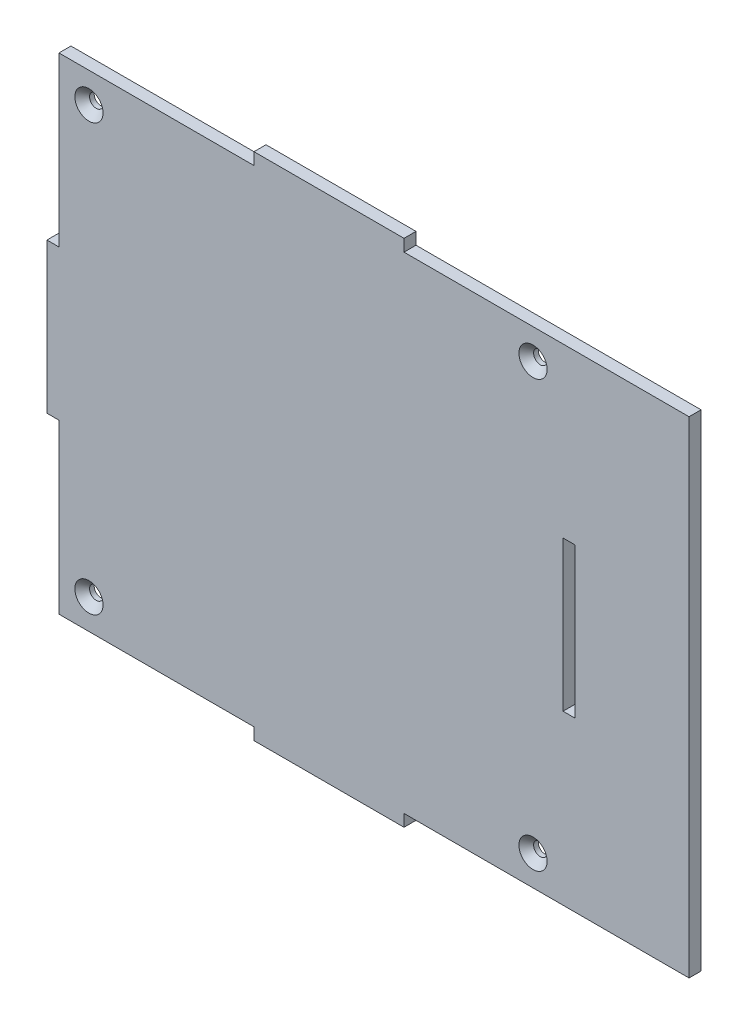
ISO-10303-21;
HEADER;
FILE_DESCRIPTION(('STEP AP214'),'2;1');
FILE_NAME('part.step','',(''),(''),'','','');
FILE_SCHEMA(('AUTOMOTIVE_DESIGN { 1 0 10303 214 1 1 1 1 }'));
ENDSEC;
DATA;
#1=APPLICATION_CONTEXT('core data for automotive mechanical design processes');
#2=APPLICATION_PROTOCOL_DEFINITION('international standard','automotive_design',2000,#1);
#3=PRODUCT_CONTEXT('',#1,'mechanical');
#4=PRODUCT('Part','Part','',(#3));
#5=PRODUCT_RELATED_PRODUCT_CATEGORY('part','',(#4));
#6=PRODUCT_DEFINITION_FORMATION('','',#4);
#7=PRODUCT_DEFINITION_CONTEXT('part definition',#1,'design');
#8=PRODUCT_DEFINITION('design','',#6,#7);
#9=PRODUCT_DEFINITION_SHAPE('','',#8);
#10=(LENGTH_UNIT() NAMED_UNIT(*) SI_UNIT(.MILLI.,.METRE.));
#11=(NAMED_UNIT(*) PLANE_ANGLE_UNIT() SI_UNIT($,.RADIAN.));
#12=(NAMED_UNIT(*) SI_UNIT($,.STERADIAN.) SOLID_ANGLE_UNIT());
#13=UNCERTAINTY_MEASURE_WITH_UNIT(LENGTH_MEASURE(1.E-05),#10,'distance_accuracy_value','');
#14=(GEOMETRIC_REPRESENTATION_CONTEXT(3) GLOBAL_UNCERTAINTY_ASSIGNED_CONTEXT((#13)) GLOBAL_UNIT_ASSIGNED_CONTEXT((#10,
#11,#12)) REPRESENTATION_CONTEXT('',''));
#15=CARTESIAN_POINT('',(0.,0.,0.));
#16=DIRECTION('',(0.,0.,1.));
#17=DIRECTION('',(1.,0.,0.));
#18=AXIS2_PLACEMENT_3D('',#15,#16,#17);
#19=CARTESIAN_POINT('',(0.,0.,4.));
#20=DIRECTION('',(0.,0.,1.));
#21=DIRECTION('',(1.,0.,0.));
#22=AXIS2_PLACEMENT_3D('',#19,#20,#21);
#23=PLANE('',#22);
#24=CARTESIAN_POINT('',(14.,71.,4.));
#25=DIRECTION('',(0.,0.,1.));
#26=DIRECTION('',(1.,0.,0.));
#27=AXIS2_PLACEMENT_3D('',#24,#25,#26);
#28=CIRCLE('',#27,4.7);
#29=CARTESIAN_POINT('',(18.7,71.,4.));
#30=VERTEX_POINT('',#29);
#31=EDGE_CURVE('E669',#30,#30,#28,.T.);
#32=ORIENTED_EDGE('',*,*,#31,.F.);
#33=EDGE_LOOP('',(#32));
#34=FACE_BOUND('',#33,.T.);
#35=CARTESIAN_POINT('',(162.,71.,4.));
#36=DIRECTION('',(0.,0.,1.));
#37=DIRECTION('',(1.,0.,0.));
#38=AXIS2_PLACEMENT_3D('',#35,#36,#37);
#39=CIRCLE('',#38,4.70000000000001);
#40=CARTESIAN_POINT('',(166.7,71.,4.));
#41=VERTEX_POINT('',#40);
#42=EDGE_CURVE('E676',#41,#41,#39,.T.);
#43=ORIENTED_EDGE('',*,*,#42,.F.);
#44=EDGE_LOOP('',(#43));
#45=FACE_BOUND('',#44,.T.);
#46=CARTESIAN_POINT('',(162.,-71.,4.));
#47=DIRECTION('',(0.,0.,1.));
#48=DIRECTION('',(1.,0.,0.));
#49=AXIS2_PLACEMENT_3D('',#46,#47,#48);
#50=CIRCLE('',#49,4.70000000000001);
#51=CARTESIAN_POINT('',(166.7,-71.,4.));
#52=VERTEX_POINT('',#51);
#53=EDGE_CURVE('E685',#52,#52,#50,.T.);
#54=ORIENTED_EDGE('',*,*,#53,.F.);
#55=EDGE_LOOP('',(#54));
#56=FACE_BOUND('',#55,.T.);
#57=CARTESIAN_POINT('',(14.,-71.,4.));
#58=DIRECTION('',(0.,0.,1.));
#59=DIRECTION('',(1.,0.,0.));
#60=AXIS2_PLACEMENT_3D('',#57,#58,#59);
#61=CIRCLE('',#60,4.7);
#62=CARTESIAN_POINT('',(18.7,-71.,4.));
#63=VERTEX_POINT('',#62);
#64=EDGE_CURVE('E694',#63,#63,#61,.T.);
#65=ORIENTED_EDGE('',*,*,#64,.F.);
#66=EDGE_LOOP('',(#65));
#67=FACE_BOUND('',#66,.T.);
#68=DIRECTION('',(0.,1.,0.));
#69=VECTOR('',#68,1.);
#70=CARTESIAN_POINT('',(0.,0.,4.));
#71=LINE('',#70,#69);
#72=CARTESIAN_POINT('',(0.,-25.,4.));
#73=VERTEX_POINT('',#72);
#74=CARTESIAN_POINT('',(0.,25.,4.));
#75=VERTEX_POINT('',#74);
#76=EDGE_CURVE('E209',#73,#75,#71,.T.);
#77=ORIENTED_EDGE('',*,*,#76,.F.);
#78=DIRECTION('',(1.,0.,0.));
#79=VECTOR('',#78,1.);
#80=CARTESIAN_POINT('',(0.,-25.,4.));
#81=LINE('',#80,#79);
#82=CARTESIAN_POINT('',(4.,-25.,4.));
#83=VERTEX_POINT('',#82);
#84=EDGE_CURVE('E212',#73,#83,#81,.T.);
#85=ORIENTED_EDGE('',*,*,#84,.T.);
#86=DIRECTION('',(0.,-1.,0.));
#87=VECTOR('',#86,1.);
#88=CARTESIAN_POINT('',(3.99999999999999,0.,4.));
#89=LINE('',#88,#87);
#90=CARTESIAN_POINT('',(4.,-81.,4.));
#91=VERTEX_POINT('',#90);
#92=EDGE_CURVE('E215',#83,#91,#89,.T.);
#93=ORIENTED_EDGE('',*,*,#92,.T.);
#94=DIRECTION('',(1.,0.,0.));
#95=VECTOR('',#94,1.);
#96=CARTESIAN_POINT('',(0.,-81.,4.));
#97=LINE('',#96,#95);
#98=CARTESIAN_POINT('',(69.,-81.,4.));
#99=VERTEX_POINT('',#98);
#100=EDGE_CURVE('E217',#91,#99,#97,.T.);
#101=ORIENTED_EDGE('',*,*,#100,.T.);
#102=DIRECTION('',(0.,-1.,0.));
#103=VECTOR('',#102,1.);
#104=CARTESIAN_POINT('',(69.,0.,4.));
#105=LINE('',#104,#103);
#106=CARTESIAN_POINT('',(69.,-85.,4.));
#107=VERTEX_POINT('',#106);
#108=EDGE_CURVE('E219',#99,#107,#105,.T.);
#109=ORIENTED_EDGE('',*,*,#108,.T.);
#110=DIRECTION('',(1.,0.,0.));
#111=VECTOR('',#110,1.);
#112=CARTESIAN_POINT('',(0.,-85.,4.));
#113=LINE('',#112,#111);
#114=CARTESIAN_POINT('',(119.,-85.,4.));
#115=VERTEX_POINT('',#114);
#116=EDGE_CURVE('E221',#107,#115,#113,.T.);
#117=ORIENTED_EDGE('',*,*,#116,.T.);
#118=DIRECTION('',(0.,1.,0.));
#119=VECTOR('',#118,1.);
#120=CARTESIAN_POINT('',(119.,0.,4.));
#121=LINE('',#120,#119);
#122=CARTESIAN_POINT('',(119.,-81.,4.));
#123=VERTEX_POINT('',#122);
#124=EDGE_CURVE('E223',#115,#123,#121,.T.);
#125=ORIENTED_EDGE('',*,*,#124,.T.);
#126=DIRECTION('',(1.,0.,0.));
#127=VECTOR('',#126,1.);
#128=CARTESIAN_POINT('',(0.,-81.,4.));
#129=LINE('',#128,#127);
#130=CARTESIAN_POINT('',(214.,-81.,4.));
#131=VERTEX_POINT('',#130);
#132=EDGE_CURVE('E225',#123,#131,#129,.T.);
#133=ORIENTED_EDGE('',*,*,#132,.T.);
#134=DIRECTION('',(0.,-1.,0.));
#135=VECTOR('',#134,1.);
#136=CARTESIAN_POINT('',(214.,0.,4.));
#137=LINE('',#136,#135);
#138=CARTESIAN_POINT('',(214.,81.,4.));
#139=VERTEX_POINT('',#138);
#140=EDGE_CURVE('E227',#139,#131,#137,.T.);
#141=ORIENTED_EDGE('',*,*,#140,.F.);
#142=DIRECTION('',(1.,0.,0.));
#143=VECTOR('',#142,1.);
#144=CARTESIAN_POINT('',(0.,81.,4.));
#145=LINE('',#144,#143);
#146=CARTESIAN_POINT('',(119.,81.,4.));
#147=VERTEX_POINT('',#146);
#148=EDGE_CURVE('E230',#147,#139,#145,.T.);
#149=ORIENTED_EDGE('',*,*,#148,.F.);
#150=DIRECTION('',(0.,-1.,0.));
#151=VECTOR('',#150,1.);
#152=CARTESIAN_POINT('',(119.,0.,4.));
#153=LINE('',#152,#151);
#154=CARTESIAN_POINT('',(119.,85.,4.));
#155=VERTEX_POINT('',#154);
#156=EDGE_CURVE('E233',#155,#147,#153,.T.);
#157=ORIENTED_EDGE('',*,*,#156,.F.);
#158=DIRECTION('',(1.,0.,0.));
#159=VECTOR('',#158,1.);
#160=CARTESIAN_POINT('',(0.,85.,4.));
#161=LINE('',#160,#159);
#162=CARTESIAN_POINT('',(69.,85.,4.));
#163=VERTEX_POINT('',#162);
#164=EDGE_CURVE('E236',#163,#155,#161,.T.);
#165=ORIENTED_EDGE('',*,*,#164,.F.);
#166=DIRECTION('',(0.,1.,0.));
#167=VECTOR('',#166,1.);
#168=CARTESIAN_POINT('',(69.,0.,4.));
#169=LINE('',#168,#167);
#170=CARTESIAN_POINT('',(69.,81.,4.));
#171=VERTEX_POINT('',#170);
#172=EDGE_CURVE('E239',#171,#163,#169,.T.);
#173=ORIENTED_EDGE('',*,*,#172,.F.);
#174=DIRECTION('',(1.,0.,0.));
#175=VECTOR('',#174,1.);
#176=CARTESIAN_POINT('',(0.,81.,4.));
#177=LINE('',#176,#175);
#178=CARTESIAN_POINT('',(4.,81.,4.));
#179=VERTEX_POINT('',#178);
#180=EDGE_CURVE('E242',#179,#171,#177,.T.);
#181=ORIENTED_EDGE('',*,*,#180,.F.);
#182=DIRECTION('',(0.,1.,0.));
#183=VECTOR('',#182,1.);
#184=CARTESIAN_POINT('',(4.,0.,4.));
#185=LINE('',#184,#183);
#186=CARTESIAN_POINT('',(4.,25.,4.));
#187=VERTEX_POINT('',#186);
#188=EDGE_CURVE('E245',#187,#179,#185,.T.);
#189=ORIENTED_EDGE('',*,*,#188,.F.);
#190=DIRECTION('',(1.,0.,0.));
#191=VECTOR('',#190,1.);
#192=CARTESIAN_POINT('',(0.,25.,4.));
#193=LINE('',#192,#191);
#194=EDGE_CURVE('E248',#75,#187,#193,.T.);
#195=ORIENTED_EDGE('',*,*,#194,.F.);
#196=EDGE_LOOP('',(#77,#85,#93,#101,#109,#117,#125,#133,#141,#149,#157,#165,#173,#181,#189,#195));
#197=FACE_BOUND('',#196,.T.);
#198=DIRECTION('',(1.,0.,0.));
#199=VECTOR('',#198,1.);
#200=CARTESIAN_POINT('',(0.,-25.,4.));
#201=LINE('',#200,#199);
#202=CARTESIAN_POINT('',(172.,-25.,4.));
#203=VERTEX_POINT('',#202);
#204=CARTESIAN_POINT('',(176.,-25.,4.));
#205=VERTEX_POINT('',#204);
#206=EDGE_CURVE('E194',#203,#205,#201,.T.);
#207=ORIENTED_EDGE('',*,*,#206,.F.);
#208=DIRECTION('',(0.,1.,0.));
#209=VECTOR('',#208,1.);
#210=CARTESIAN_POINT('',(172.,0.,4.));
#211=LINE('',#210,#209);
#212=CARTESIAN_POINT('',(172.,25.,4.));
#213=VERTEX_POINT('',#212);
#214=EDGE_CURVE('E52',#203,#213,#211,.T.);
#215=ORIENTED_EDGE('',*,*,#214,.T.);
#216=DIRECTION('',(1.,0.,0.));
#217=VECTOR('',#216,1.);
#218=CARTESIAN_POINT('',(0.,25.,4.));
#219=LINE('',#218,#217);
#220=CARTESIAN_POINT('',(176.,25.,4.));
#221=VERTEX_POINT('',#220);
#222=EDGE_CURVE('E181',#213,#221,#219,.T.);
#223=ORIENTED_EDGE('',*,*,#222,.T.);
#224=DIRECTION('',(0.,1.,0.));
#225=VECTOR('',#224,1.);
#226=CARTESIAN_POINT('',(176.,0.,4.));
#227=LINE('',#226,#225);
#228=EDGE_CURVE('E200',#205,#221,#227,.T.);
#229=ORIENTED_EDGE('',*,*,#228,.F.);
#230=EDGE_LOOP('',(#207,#215,#223,#229));
#231=FACE_BOUND('',#230,.T.);
#232=ADVANCED_FACE('F37',(#34,#45,#56,#67,#197,#231),#23,.T.);
#233=CARTESIAN_POINT('',(0.,0.,0.));
#234=DIRECTION('',(0.,0.,1.));
#235=DIRECTION('',(1.,0.,0.));
#236=AXIS2_PLACEMENT_3D('',#233,#234,#235);
#237=PLANE('',#236);
#238=CARTESIAN_POINT('',(14.,71.,0.));
#239=DIRECTION('',(0.,0.,1.));
#240=DIRECTION('',(1.,0.,0.));
#241=AXIS2_PLACEMENT_3D('',#238,#239,#240);
#242=CIRCLE('',#241,2.25);
#243=CARTESIAN_POINT('',(16.25,71.,0.));
#244=VERTEX_POINT('',#243);
#245=EDGE_CURVE('E671',#244,#244,#242,.T.);
#246=ORIENTED_EDGE('',*,*,#245,.T.);
#247=EDGE_LOOP('',(#246));
#248=FACE_BOUND('',#247,.T.);
#249=CARTESIAN_POINT('',(162.,71.,0.));
#250=DIRECTION('',(0.,0.,1.));
#251=DIRECTION('',(1.,0.,0.));
#252=AXIS2_PLACEMENT_3D('',#249,#250,#251);
#253=CIRCLE('',#252,2.25);
#254=CARTESIAN_POINT('',(164.25,71.,0.));
#255=VERTEX_POINT('',#254);
#256=EDGE_CURVE('E682',#255,#255,#253,.T.);
#257=ORIENTED_EDGE('',*,*,#256,.T.);
#258=EDGE_LOOP('',(#257));
#259=FACE_BOUND('',#258,.T.);
#260=CARTESIAN_POINT('',(162.,-71.,0.));
#261=DIRECTION('',(0.,0.,1.));
#262=DIRECTION('',(1.,0.,0.));
#263=AXIS2_PLACEMENT_3D('',#260,#261,#262);
#264=CIRCLE('',#263,2.25);
#265=CARTESIAN_POINT('',(164.25,-71.,0.));
#266=VERTEX_POINT('',#265);
#267=EDGE_CURVE('E691',#266,#266,#264,.T.);
#268=ORIENTED_EDGE('',*,*,#267,.T.);
#269=EDGE_LOOP('',(#268));
#270=FACE_BOUND('',#269,.T.);
#271=CARTESIAN_POINT('',(14.,-71.,0.));
#272=DIRECTION('',(0.,0.,1.));
#273=DIRECTION('',(1.,0.,0.));
#274=AXIS2_PLACEMENT_3D('',#271,#272,#273);
#275=CIRCLE('',#274,2.25);
#276=CARTESIAN_POINT('',(16.25,-71.,0.));
#277=VERTEX_POINT('',#276);
#278=EDGE_CURVE('E700',#277,#277,#275,.T.);
#279=ORIENTED_EDGE('',*,*,#278,.T.);
#280=EDGE_LOOP('',(#279));
#281=FACE_BOUND('',#280,.T.);
#282=DIRECTION('',(0.,1.,0.));
#283=VECTOR('',#282,1.);
#284=CARTESIAN_POINT('',(0.,0.,0.));
#285=LINE('',#284,#283);
#286=CARTESIAN_POINT('',(0.,-25.,0.));
#287=VERTEX_POINT('',#286);
#288=CARTESIAN_POINT('',(0.,25.,0.));
#289=VERTEX_POINT('',#288);
#290=EDGE_CURVE('E187',#287,#289,#285,.T.);
#291=ORIENTED_EDGE('',*,*,#290,.T.);
#292=DIRECTION('',(1.,0.,0.));
#293=VECTOR('',#292,1.);
#294=CARTESIAN_POINT('',(0.,25.,0.));
#295=LINE('',#294,#293);
#296=CARTESIAN_POINT('',(4.,25.,0.));
#297=VERTEX_POINT('',#296);
#298=EDGE_CURVE('E213',#289,#297,#295,.T.);
#299=ORIENTED_EDGE('',*,*,#298,.T.);
#300=DIRECTION('',(0.,1.,0.));
#301=VECTOR('',#300,1.);
#302=CARTESIAN_POINT('',(4.,0.,0.));
#303=LINE('',#302,#301);
#304=CARTESIAN_POINT('',(4.,81.,0.));
#305=VERTEX_POINT('',#304);
#306=EDGE_CURVE('E287',#297,#305,#303,.T.);
#307=ORIENTED_EDGE('',*,*,#306,.T.);
#308=DIRECTION('',(1.,0.,0.));
#309=VECTOR('',#308,1.);
#310=CARTESIAN_POINT('',(0.,81.,0.));
#311=LINE('',#310,#309);
#312=CARTESIAN_POINT('',(69.,81.,0.));
#313=VERTEX_POINT('',#312);
#314=EDGE_CURVE('E284',#305,#313,#311,.T.);
#315=ORIENTED_EDGE('',*,*,#314,.T.);
#316=DIRECTION('',(0.,1.,0.));
#317=VECTOR('',#316,1.);
#318=CARTESIAN_POINT('',(69.,0.,0.));
#319=LINE('',#318,#317);
#320=CARTESIAN_POINT('',(69.,85.,0.));
#321=VERTEX_POINT('',#320);
#322=EDGE_CURVE('E281',#313,#321,#319,.T.);
#323=ORIENTED_EDGE('',*,*,#322,.T.);
#324=DIRECTION('',(1.,0.,0.));
#325=VECTOR('',#324,1.);
#326=CARTESIAN_POINT('',(0.,85.,0.));
#327=LINE('',#326,#325);
#328=CARTESIAN_POINT('',(119.,85.,0.));
#329=VERTEX_POINT('',#328);
#330=EDGE_CURVE('E278',#321,#329,#327,.T.);
#331=ORIENTED_EDGE('',*,*,#330,.T.);
#332=DIRECTION('',(0.,-1.,0.));
#333=VECTOR('',#332,1.);
#334=CARTESIAN_POINT('',(119.,0.,0.));
#335=LINE('',#334,#333);
#336=CARTESIAN_POINT('',(119.,81.,0.));
#337=VERTEX_POINT('',#336);
#338=EDGE_CURVE('E275',#329,#337,#335,.T.);
#339=ORIENTED_EDGE('',*,*,#338,.T.);
#340=DIRECTION('',(1.,0.,0.));
#341=VECTOR('',#340,1.);
#342=CARTESIAN_POINT('',(0.,81.,0.));
#343=LINE('',#342,#341);
#344=CARTESIAN_POINT('',(214.,81.,0.));
#345=VERTEX_POINT('',#344);
#346=EDGE_CURVE('E272',#337,#345,#343,.T.);
#347=ORIENTED_EDGE('',*,*,#346,.T.);
#348=DIRECTION('',(0.,-1.,0.));
#349=VECTOR('',#348,1.);
#350=CARTESIAN_POINT('',(214.,0.,0.));
#351=LINE('',#350,#349);
#352=CARTESIAN_POINT('',(214.,-81.,0.));
#353=VERTEX_POINT('',#352);
#354=EDGE_CURVE('E269',#345,#353,#351,.T.);
#355=ORIENTED_EDGE('',*,*,#354,.T.);
#356=DIRECTION('',(1.,0.,0.));
#357=VECTOR('',#356,1.);
#358=CARTESIAN_POINT('',(0.,-81.,0.));
#359=LINE('',#358,#357);
#360=CARTESIAN_POINT('',(119.,-81.,0.));
#361=VERTEX_POINT('',#360);
#362=EDGE_CURVE('E266',#361,#353,#359,.T.);
#363=ORIENTED_EDGE('',*,*,#362,.F.);
#364=DIRECTION('',(0.,1.,0.));
#365=VECTOR('',#364,1.);
#366=CARTESIAN_POINT('',(119.,0.,0.));
#367=LINE('',#366,#365);
#368=CARTESIAN_POINT('',(119.,-85.,0.));
#369=VERTEX_POINT('',#368);
#370=EDGE_CURVE('E264',#369,#361,#367,.T.);
#371=ORIENTED_EDGE('',*,*,#370,.F.);
#372=DIRECTION('',(1.,0.,0.));
#373=VECTOR('',#372,1.);
#374=CARTESIAN_POINT('',(0.,-85.,0.));
#375=LINE('',#374,#373);
#376=CARTESIAN_POINT('',(69.,-85.,0.));
#377=VERTEX_POINT('',#376);
#378=EDGE_CURVE('E262',#377,#369,#375,.T.);
#379=ORIENTED_EDGE('',*,*,#378,.F.);
#380=DIRECTION('',(0.,-1.,0.));
#381=VECTOR('',#380,1.);
#382=CARTESIAN_POINT('',(69.,0.,0.));
#383=LINE('',#382,#381);
#384=CARTESIAN_POINT('',(69.,-81.,0.));
#385=VERTEX_POINT('',#384);
#386=EDGE_CURVE('E260',#385,#377,#383,.T.);
#387=ORIENTED_EDGE('',*,*,#386,.F.);
#388=DIRECTION('',(1.,0.,0.));
#389=VECTOR('',#388,1.);
#390=CARTESIAN_POINT('',(0.,-81.,0.));
#391=LINE('',#390,#389);
#392=CARTESIAN_POINT('',(4.,-81.,0.));
#393=VERTEX_POINT('',#392);
#394=EDGE_CURVE('E258',#393,#385,#391,.T.);
#395=ORIENTED_EDGE('',*,*,#394,.F.);
#396=DIRECTION('',(0.,-1.,0.));
#397=VECTOR('',#396,1.);
#398=CARTESIAN_POINT('',(3.99999999999999,0.,0.));
#399=LINE('',#398,#397);
#400=CARTESIAN_POINT('',(4.,-25.,0.));
#401=VERTEX_POINT('',#400);
#402=EDGE_CURVE('E256',#401,#393,#399,.T.);
#403=ORIENTED_EDGE('',*,*,#402,.F.);
#404=DIRECTION('',(1.,0.,0.));
#405=VECTOR('',#404,1.);
#406=CARTESIAN_POINT('',(0.,-25.,0.));
#407=LINE('',#406,#405);
#408=EDGE_CURVE('E254',#287,#401,#407,.T.);
#409=ORIENTED_EDGE('',*,*,#408,.F.);
#410=EDGE_LOOP('',(#291,#299,#307,#315,#323,#331,#339,#347,#355,#363,#371,#379,#387,#395,#403,#409));
#411=FACE_BOUND('',#410,.T.);
#412=DIRECTION('',(0.,-1.,0.));
#413=VECTOR('',#412,1.);
#414=CARTESIAN_POINT('',(172.,0.,0.));
#415=LINE('',#414,#413);
#416=CARTESIAN_POINT('',(172.,25.,0.));
#417=VERTEX_POINT('',#416);
#418=CARTESIAN_POINT('',(172.,-25.,0.));
#419=VERTEX_POINT('',#418);
#420=EDGE_CURVE('E175',#417,#419,#415,.T.);
#421=ORIENTED_EDGE('',*,*,#420,.T.);
#422=DIRECTION('',(-1.,0.,0.));
#423=VECTOR('',#422,1.);
#424=CARTESIAN_POINT('',(0.,-25.,0.));
#425=LINE('',#424,#423);
#426=CARTESIAN_POINT('',(176.,-25.,0.));
#427=VERTEX_POINT('',#426);
#428=EDGE_CURVE('E184',#427,#419,#425,.T.);
#429=ORIENTED_EDGE('',*,*,#428,.F.);
#430=DIRECTION('',(0.,-1.,0.));
#431=VECTOR('',#430,1.);
#432=CARTESIAN_POINT('',(176.,0.,0.));
#433=LINE('',#432,#431);
#434=CARTESIAN_POINT('',(176.,25.,0.));
#435=VERTEX_POINT('',#434);
#436=EDGE_CURVE('E60',#435,#427,#433,.T.);
#437=ORIENTED_EDGE('',*,*,#436,.F.);
#438=DIRECTION('',(-1.,0.,0.));
#439=VECTOR('',#438,1.);
#440=CARTESIAN_POINT('',(0.,25.,0.));
#441=LINE('',#440,#439);
#442=EDGE_CURVE('E192',#435,#417,#441,.T.);
#443=ORIENTED_EDGE('',*,*,#442,.T.);
#444=EDGE_LOOP('',(#421,#429,#437,#443));
#445=FACE_BOUND('',#444,.T.);
#446=ADVANCED_FACE('F190',(#248,#259,#270,#281,#411,#445),#237,.F.);
#447=CARTESIAN_POINT('',(0.,0.,4.));
#448=DIRECTION('',(-1.,0.,0.));
#449=DIRECTION('',(0.,0.,1.));
#450=AXIS2_PLACEMENT_3D('',#447,#448,#449);
#451=PLANE('',#450);
#452=ORIENTED_EDGE('',*,*,#290,.F.);
#453=DIRECTION('',(0.,0.,-1.));
#454=VECTOR('',#453,1.);
#455=CARTESIAN_POINT('',(0.,-25.,4.));
#456=LINE('',#455,#454);
#457=EDGE_CURVE('E11',#73,#287,#456,.T.);
#458=ORIENTED_EDGE('',*,*,#457,.F.);
#459=ORIENTED_EDGE('',*,*,#76,.T.);
#460=DIRECTION('',(0.,0.,-1.));
#461=VECTOR('',#460,1.);
#462=CARTESIAN_POINT('',(0.,25.,4.));
#463=LINE('',#462,#461);
#464=EDGE_CURVE('E251',#75,#289,#463,.T.);
#465=ORIENTED_EDGE('',*,*,#464,.T.);
#466=EDGE_LOOP('',(#452,#458,#459,#465));
#467=FACE_BOUND('',#466,.T.);
#468=ADVANCED_FACE('F39',(#467),#451,.T.);
#469=CARTESIAN_POINT('',(0.,-25.,4.));
#470=DIRECTION('',(0.,1.,0.));
#471=DIRECTION('',(0.,0.,1.));
#472=AXIS2_PLACEMENT_3D('',#469,#470,#471);
#473=PLANE('',#472);
#474=ORIENTED_EDGE('',*,*,#408,.T.);
#475=DIRECTION('',(0.,0.,-1.));
#476=VECTOR('',#475,1.);
#477=CARTESIAN_POINT('',(4.,-25.,4.));
#478=LINE('',#477,#476);
#479=EDGE_CURVE('E45',#83,#401,#478,.T.);
#480=ORIENTED_EDGE('',*,*,#479,.F.);
#481=ORIENTED_EDGE('',*,*,#84,.F.);
#482=ORIENTED_EDGE('',*,*,#457,.T.);
#483=EDGE_LOOP('',(#474,#480,#481,#482));
#484=FACE_BOUND('',#483,.T.);
#485=ADVANCED_FACE('F352',(#484),#473,.F.);
#486=CARTESIAN_POINT('',(3.99999999999999,0.,4.));
#487=DIRECTION('',(1.,0.,0.));
#488=DIRECTION('',(0.,1.,0.));
#489=AXIS2_PLACEMENT_3D('',#486,#487,#488);
#490=PLANE('',#489);
#491=ORIENTED_EDGE('',*,*,#402,.T.);
#492=DIRECTION('',(0.,0.,-1.));
#493=VECTOR('',#492,1.);
#494=CARTESIAN_POINT('',(4.,-81.,4.));
#495=LINE('',#494,#493);
#496=EDGE_CURVE('E321',#91,#393,#495,.T.);
#497=ORIENTED_EDGE('',*,*,#496,.F.);
#498=ORIENTED_EDGE('',*,*,#92,.F.);
#499=ORIENTED_EDGE('',*,*,#479,.T.);
#500=EDGE_LOOP('',(#491,#497,#498,#499));
#501=FACE_BOUND('',#500,.T.);
#502=ADVANCED_FACE('F328',(#501),#490,.F.);
#503=CARTESIAN_POINT('',(0.,-81.,4.));
#504=DIRECTION('',(0.,1.,0.));
#505=DIRECTION('',(0.,0.,1.));
#506=AXIS2_PLACEMENT_3D('',#503,#504,#505);
#507=PLANE('',#506);
#508=ORIENTED_EDGE('',*,*,#394,.T.);
#509=DIRECTION('',(0.,0.,-1.));
#510=VECTOR('',#509,1.);
#511=CARTESIAN_POINT('',(69.,-81.,4.));
#512=LINE('',#511,#510);
#513=EDGE_CURVE('E318',#99,#385,#512,.T.);
#514=ORIENTED_EDGE('',*,*,#513,.F.);
#515=ORIENTED_EDGE('',*,*,#100,.F.);
#516=ORIENTED_EDGE('',*,*,#496,.T.);
#517=EDGE_LOOP('',(#508,#514,#515,#516));
#518=FACE_BOUND('',#517,.T.);
#519=ADVANCED_FACE('F340',(#518),#507,.F.);
#520=CARTESIAN_POINT('',(69.,0.,4.));
#521=DIRECTION('',(1.,0.,0.));
#522=DIRECTION('',(0.,0.,-1.));
#523=AXIS2_PLACEMENT_3D('',#520,#521,#522);
#524=PLANE('',#523);
#525=ORIENTED_EDGE('',*,*,#386,.T.);
#526=DIRECTION('',(0.,0.,-1.));
#527=VECTOR('',#526,1.);
#528=CARTESIAN_POINT('',(69.,-85.,4.));
#529=LINE('',#528,#527);
#530=EDGE_CURVE('E315',#107,#377,#529,.T.);
#531=ORIENTED_EDGE('',*,*,#530,.F.);
#532=ORIENTED_EDGE('',*,*,#108,.F.);
#533=ORIENTED_EDGE('',*,*,#513,.T.);
#534=EDGE_LOOP('',(#525,#531,#532,#533));
#535=FACE_BOUND('',#534,.T.);
#536=ADVANCED_FACE('F344',(#535),#524,.F.);
#537=CARTESIAN_POINT('',(0.,-85.,4.));
#538=DIRECTION('',(0.,1.,0.));
#539=DIRECTION('',(-1.,0.,0.));
#540=AXIS2_PLACEMENT_3D('',#537,#538,#539);
#541=PLANE('',#540);
#542=ORIENTED_EDGE('',*,*,#378,.T.);
#543=DIRECTION('',(0.,0.,-1.));
#544=VECTOR('',#543,1.);
#545=CARTESIAN_POINT('',(119.,-85.,4.));
#546=LINE('',#545,#544);
#547=EDGE_CURVE('E312',#115,#369,#546,.T.);
#548=ORIENTED_EDGE('',*,*,#547,.F.);
#549=ORIENTED_EDGE('',*,*,#116,.F.);
#550=ORIENTED_EDGE('',*,*,#530,.T.);
#551=EDGE_LOOP('',(#542,#548,#549,#550));
#552=FACE_BOUND('',#551,.T.);
#553=ADVANCED_FACE('F396',(#552),#541,.F.);
#554=CARTESIAN_POINT('',(119.,0.,4.));
#555=DIRECTION('',(-1.,0.,0.));
#556=DIRECTION('',(0.,0.,1.));
#557=AXIS2_PLACEMENT_3D('',#554,#555,#556);
#558=PLANE('',#557);
#559=ORIENTED_EDGE('',*,*,#370,.T.);
#560=DIRECTION('',(0.,0.,-1.));
#561=VECTOR('',#560,1.);
#562=CARTESIAN_POINT('',(119.,-81.,4.));
#563=LINE('',#562,#561);
#564=EDGE_CURVE('E309',#123,#361,#563,.T.);
#565=ORIENTED_EDGE('',*,*,#564,.F.);
#566=ORIENTED_EDGE('',*,*,#124,.F.);
#567=ORIENTED_EDGE('',*,*,#547,.T.);
#568=EDGE_LOOP('',(#559,#565,#566,#567));
#569=FACE_BOUND('',#568,.T.);
#570=ADVANCED_FACE('F394',(#569),#558,.F.);
#571=CARTESIAN_POINT('',(0.,-81.,4.));
#572=DIRECTION('',(0.,1.,0.));
#573=DIRECTION('',(0.,0.,1.));
#574=AXIS2_PLACEMENT_3D('',#571,#572,#573);
#575=PLANE('',#574);
#576=ORIENTED_EDGE('',*,*,#362,.T.);
#577=DIRECTION('',(0.,0.,-1.));
#578=VECTOR('',#577,1.);
#579=CARTESIAN_POINT('',(214.,-81.,4.));
#580=LINE('',#579,#578);
#581=EDGE_CURVE('E307',#131,#353,#580,.T.);
#582=ORIENTED_EDGE('',*,*,#581,.F.);
#583=ORIENTED_EDGE('',*,*,#132,.F.);
#584=ORIENTED_EDGE('',*,*,#564,.T.);
#585=EDGE_LOOP('',(#576,#582,#583,#584));
#586=FACE_BOUND('',#585,.T.);
#587=ADVANCED_FACE('F389',(#586),#575,.F.);
#588=CARTESIAN_POINT('',(214.,0.,4.));
#589=DIRECTION('',(1.,0.,0.));
#590=DIRECTION('',(0.,0.,-1.));
#591=AXIS2_PLACEMENT_3D('',#588,#589,#590);
#592=PLANE('',#591);
#593=ORIENTED_EDGE('',*,*,#354,.F.);
#594=DIRECTION('',(0.,0.,-1.));
#595=VECTOR('',#594,1.);
#596=CARTESIAN_POINT('',(214.,81.,4.));
#597=LINE('',#596,#595);
#598=EDGE_CURVE('E305',#139,#345,#597,.T.);
#599=ORIENTED_EDGE('',*,*,#598,.F.);
#600=ORIENTED_EDGE('',*,*,#140,.T.);
#601=ORIENTED_EDGE('',*,*,#581,.T.);
#602=EDGE_LOOP('',(#593,#599,#600,#601));
#603=FACE_BOUND('',#602,.T.);
#604=ADVANCED_FACE('F384',(#603),#592,.T.);
#605=CARTESIAN_POINT('',(0.,81.,4.));
#606=DIRECTION('',(0.,1.,0.));
#607=DIRECTION('',(0.,0.,1.));
#608=AXIS2_PLACEMENT_3D('',#605,#606,#607);
#609=PLANE('',#608);
#610=ORIENTED_EDGE('',*,*,#346,.F.);
#611=DIRECTION('',(0.,0.,-1.));
#612=VECTOR('',#611,1.);
#613=CARTESIAN_POINT('',(119.,81.,4.));
#614=LINE('',#613,#612);
#615=EDGE_CURVE('E303',#147,#337,#614,.T.);
#616=ORIENTED_EDGE('',*,*,#615,.F.);
#617=ORIENTED_EDGE('',*,*,#148,.T.);
#618=ORIENTED_EDGE('',*,*,#598,.T.);
#619=EDGE_LOOP('',(#610,#616,#617,#618));
#620=FACE_BOUND('',#619,.T.);
#621=ADVANCED_FACE('F380',(#620),#609,.T.);
#622=CARTESIAN_POINT('',(119.,0.,4.));
#623=DIRECTION('',(1.,0.,0.));
#624=DIRECTION('',(0.,0.,-1.));
#625=AXIS2_PLACEMENT_3D('',#622,#623,#624);
#626=PLANE('',#625);
#627=ORIENTED_EDGE('',*,*,#338,.F.);
#628=DIRECTION('',(0.,0.,-1.));
#629=VECTOR('',#628,1.);
#630=CARTESIAN_POINT('',(119.,85.,4.));
#631=LINE('',#630,#629);
#632=EDGE_CURVE('E301',#155,#329,#631,.T.);
#633=ORIENTED_EDGE('',*,*,#632,.F.);
#634=ORIENTED_EDGE('',*,*,#156,.T.);
#635=ORIENTED_EDGE('',*,*,#615,.T.);
#636=EDGE_LOOP('',(#627,#633,#634,#635));
#637=FACE_BOUND('',#636,.T.);
#638=ADVANCED_FACE('F376',(#637),#626,.T.);
#639=CARTESIAN_POINT('',(0.,85.,4.));
#640=DIRECTION('',(0.,1.,0.));
#641=DIRECTION('',(-1.,0.,0.));
#642=AXIS2_PLACEMENT_3D('',#639,#640,#641);
#643=PLANE('',#642);
#644=ORIENTED_EDGE('',*,*,#330,.F.);
#645=DIRECTION('',(0.,0.,-1.));
#646=VECTOR('',#645,1.);
#647=CARTESIAN_POINT('',(69.,85.,4.));
#648=LINE('',#647,#646);
#649=EDGE_CURVE('E299',#163,#321,#648,.T.);
#650=ORIENTED_EDGE('',*,*,#649,.F.);
#651=ORIENTED_EDGE('',*,*,#164,.T.);
#652=ORIENTED_EDGE('',*,*,#632,.T.);
#653=EDGE_LOOP('',(#644,#650,#651,#652));
#654=FACE_BOUND('',#653,.T.);
#655=ADVANCED_FACE('F372',(#654),#643,.T.);
#656=CARTESIAN_POINT('',(69.,0.,4.));
#657=DIRECTION('',(-1.,0.,0.));
#658=DIRECTION('',(0.,0.,1.));
#659=AXIS2_PLACEMENT_3D('',#656,#657,#658);
#660=PLANE('',#659);
#661=ORIENTED_EDGE('',*,*,#322,.F.);
#662=DIRECTION('',(0.,0.,-1.));
#663=VECTOR('',#662,1.);
#664=CARTESIAN_POINT('',(69.,81.,4.));
#665=LINE('',#664,#663);
#666=EDGE_CURVE('E297',#171,#313,#665,.T.);
#667=ORIENTED_EDGE('',*,*,#666,.F.);
#668=ORIENTED_EDGE('',*,*,#172,.T.);
#669=ORIENTED_EDGE('',*,*,#649,.T.);
#670=EDGE_LOOP('',(#661,#667,#668,#669));
#671=FACE_BOUND('',#670,.T.);
#672=ADVANCED_FACE('F368',(#671),#660,.T.);
#673=CARTESIAN_POINT('',(0.,81.,4.));
#674=DIRECTION('',(0.,1.,0.));
#675=DIRECTION('',(0.,0.,1.));
#676=AXIS2_PLACEMENT_3D('',#673,#674,#675);
#677=PLANE('',#676);
#678=ORIENTED_EDGE('',*,*,#314,.F.);
#679=DIRECTION('',(0.,0.,-1.));
#680=VECTOR('',#679,1.);
#681=CARTESIAN_POINT('',(4.,81.,4.));
#682=LINE('',#681,#680);
#683=EDGE_CURVE('E295',#179,#305,#682,.T.);
#684=ORIENTED_EDGE('',*,*,#683,.F.);
#685=ORIENTED_EDGE('',*,*,#180,.T.);
#686=ORIENTED_EDGE('',*,*,#666,.T.);
#687=EDGE_LOOP('',(#678,#684,#685,#686));
#688=FACE_BOUND('',#687,.T.);
#689=ADVANCED_FACE('F364',(#688),#677,.T.);
#690=CARTESIAN_POINT('',(4.,0.,4.));
#691=DIRECTION('',(-1.,0.,0.));
#692=DIRECTION('',(0.,-1.,0.));
#693=AXIS2_PLACEMENT_3D('',#690,#691,#692);
#694=PLANE('',#693);
#695=ORIENTED_EDGE('',*,*,#306,.F.);
#696=DIRECTION('',(0.,0.,-1.));
#697=VECTOR('',#696,1.);
#698=CARTESIAN_POINT('',(4.,25.,4.));
#699=LINE('',#698,#697);
#700=EDGE_CURVE('E293',#187,#297,#699,.T.);
#701=ORIENTED_EDGE('',*,*,#700,.F.);
#702=ORIENTED_EDGE('',*,*,#188,.T.);
#703=ORIENTED_EDGE('',*,*,#683,.T.);
#704=EDGE_LOOP('',(#695,#701,#702,#703));
#705=FACE_BOUND('',#704,.T.);
#706=ADVANCED_FACE('F360',(#705),#694,.T.);
#707=CARTESIAN_POINT('',(0.,25.,4.));
#708=DIRECTION('',(0.,1.,0.));
#709=DIRECTION('',(0.,0.,1.));
#710=AXIS2_PLACEMENT_3D('',#707,#708,#709);
#711=PLANE('',#710);
#712=ORIENTED_EDGE('',*,*,#298,.F.);
#713=ORIENTED_EDGE('',*,*,#464,.F.);
#714=ORIENTED_EDGE('',*,*,#194,.T.);
#715=ORIENTED_EDGE('',*,*,#700,.T.);
#716=EDGE_LOOP('',(#712,#713,#714,#715));
#717=FACE_BOUND('',#716,.T.);
#718=ADVANCED_FACE('F356',(#717),#711,.T.);
#719=CARTESIAN_POINT('',(172.,0.,-0.00100000000000013));
#720=DIRECTION('',(1.,0.,0.));
#721=DIRECTION('',(0.,0.,-1.));
#722=AXIS2_PLACEMENT_3D('',#719,#720,#721);
#723=PLANE('',#722);
#724=DIRECTION('',(0.,0.,1.));
#725=VECTOR('',#724,1.);
#726=CARTESIAN_POINT('',(172.,25.,-0.00100000000000013));
#727=LINE('',#726,#725);
#728=EDGE_CURVE('E188',#417,#213,#727,.T.);
#729=ORIENTED_EDGE('',*,*,#728,.T.);
#730=ORIENTED_EDGE('',*,*,#214,.F.);
#731=DIRECTION('',(0.,0.,1.));
#732=VECTOR('',#731,1.);
#733=CARTESIAN_POINT('',(172.,-25.,-0.00100000000000013));
#734=LINE('',#733,#732);
#735=EDGE_CURVE('E171',#419,#203,#734,.T.);
#736=ORIENTED_EDGE('',*,*,#735,.F.);
#737=ORIENTED_EDGE('',*,*,#420,.F.);
#738=EDGE_LOOP('',(#729,#730,#736,#737));
#739=FACE_BOUND('',#738,.T.);
#740=ADVANCED_FACE('F173',(#739),#723,.T.);
#741=CARTESIAN_POINT('',(0.,25.,-0.00100000000000013));
#742=DIRECTION('',(0.,-1.,0.));
#743=DIRECTION('',(0.,0.,-1.));
#744=AXIS2_PLACEMENT_3D('',#741,#742,#743);
#745=PLANE('',#744);
#746=DIRECTION('',(0.,0.,1.));
#747=VECTOR('',#746,1.);
#748=CARTESIAN_POINT('',(176.,25.,-0.00100000000000013));
#749=LINE('',#748,#747);
#750=EDGE_CURVE('E206',#435,#221,#749,.T.);
#751=ORIENTED_EDGE('',*,*,#750,.T.);
#752=ORIENTED_EDGE('',*,*,#222,.F.);
#753=ORIENTED_EDGE('',*,*,#728,.F.);
#754=ORIENTED_EDGE('',*,*,#442,.F.);
#755=EDGE_LOOP('',(#751,#752,#753,#754));
#756=FACE_BOUND('',#755,.T.);
#757=ADVANCED_FACE('F477',(#756),#745,.T.);
#758=CARTESIAN_POINT('',(176.,0.,-0.00100000000000013));
#759=DIRECTION('',(1.,0.,0.));
#760=DIRECTION('',(0.,0.,-1.));
#761=AXIS2_PLACEMENT_3D('',#758,#759,#760);
#762=PLANE('',#761);
#763=ORIENTED_EDGE('',*,*,#436,.T.);
#764=DIRECTION('',(0.,0.,1.));
#765=VECTOR('',#764,1.);
#766=CARTESIAN_POINT('',(176.,-25.,-0.00100000000000013));
#767=LINE('',#766,#765);
#768=EDGE_CURVE('E180',#427,#205,#767,.T.);
#769=ORIENTED_EDGE('',*,*,#768,.T.);
#770=ORIENTED_EDGE('',*,*,#228,.T.);
#771=ORIENTED_EDGE('',*,*,#750,.F.);
#772=EDGE_LOOP('',(#763,#769,#770,#771));
#773=FACE_BOUND('',#772,.T.);
#774=ADVANCED_FACE('F483',(#773),#762,.F.);
#775=CARTESIAN_POINT('',(0.,-25.,-0.00100000000000013));
#776=DIRECTION('',(0.,-1.,0.));
#777=DIRECTION('',(0.,0.,-1.));
#778=AXIS2_PLACEMENT_3D('',#775,#776,#777);
#779=PLANE('',#778);
#780=ORIENTED_EDGE('',*,*,#428,.T.);
#781=ORIENTED_EDGE('',*,*,#735,.T.);
#782=ORIENTED_EDGE('',*,*,#206,.T.);
#783=ORIENTED_EDGE('',*,*,#768,.F.);
#784=EDGE_LOOP('',(#780,#781,#782,#783));
#785=FACE_BOUND('',#784,.T.);
#786=ADVANCED_FACE('F185',(#785),#779,.F.);
#787=CARTESIAN_POINT('',(14.,-71.,4.));
#788=DIRECTION('',(0.,0.,1.));
#789=DIRECTION('',(1.,0.,0.));
#790=AXIS2_PLACEMENT_3D('',#787,#788,#789);
#791=CYLINDRICAL_SURFACE('',#790,2.25);
#792=ORIENTED_EDGE('',*,*,#278,.F.);
#793=EDGE_LOOP('',(#792));
#794=FACE_BOUND('',#793,.T.);
#795=CARTESIAN_POINT('',(14.,-71.,1.55));
#796=DIRECTION('',(0.,0.,1.));
#797=DIRECTION('',(1.,0.,0.));
#798=AXIS2_PLACEMENT_3D('',#795,#796,#797);
#799=CIRCLE('',#798,2.25);
#800=CARTESIAN_POINT('',(16.25,-71.,1.55));
#801=VERTEX_POINT('',#800);
#802=EDGE_CURVE('E697',#801,#801,#799,.T.);
#803=ORIENTED_EDGE('',*,*,#802,.T.);
#804=EDGE_LOOP('',(#803));
#805=FACE_BOUND('',#804,.T.);
#806=ADVANCED_FACE('F497',(#794,#805),#791,.F.);
#807=CARTESIAN_POINT('',(14.,-71.,4.));
#808=DIRECTION('',(0.,0.,1.));
#809=DIRECTION('',(1.,0.,0.));
#810=AXIS2_PLACEMENT_3D('',#807,#808,#809);
#811=CONICAL_SURFACE('',#810,4.7,0.785398163397448);
#812=ORIENTED_EDGE('',*,*,#802,.F.);
#813=EDGE_LOOP('',(#812));
#814=FACE_BOUND('',#813,.T.);
#815=ORIENTED_EDGE('',*,*,#64,.T.);
#816=EDGE_LOOP('',(#815));
#817=FACE_BOUND('',#816,.T.);
#818=ADVANCED_FACE('F503',(#814,#817),#811,.F.);
#819=CARTESIAN_POINT('',(162.,-71.,4.));
#820=DIRECTION('',(0.,0.,1.));
#821=DIRECTION('',(1.,0.,0.));
#822=AXIS2_PLACEMENT_3D('',#819,#820,#821);
#823=CYLINDRICAL_SURFACE('',#822,2.25);
#824=ORIENTED_EDGE('',*,*,#267,.F.);
#825=EDGE_LOOP('',(#824));
#826=FACE_BOUND('',#825,.T.);
#827=CARTESIAN_POINT('',(162.,-71.,1.55));
#828=DIRECTION('',(0.,0.,1.));
#829=DIRECTION('',(1.,0.,0.));
#830=AXIS2_PLACEMENT_3D('',#827,#828,#829);
#831=CIRCLE('',#830,2.25);
#832=CARTESIAN_POINT('',(164.25,-71.,1.55));
#833=VERTEX_POINT('',#832);
#834=EDGE_CURVE('E688',#833,#833,#831,.T.);
#835=ORIENTED_EDGE('',*,*,#834,.T.);
#836=EDGE_LOOP('',(#835));
#837=FACE_BOUND('',#836,.T.);
#838=ADVANCED_FACE('F512',(#826,#837),#823,.F.);
#839=CARTESIAN_POINT('',(162.,-71.,4.));
#840=DIRECTION('',(0.,0.,1.));
#841=DIRECTION('',(1.,0.,0.));
#842=AXIS2_PLACEMENT_3D('',#839,#840,#841);
#843=CONICAL_SURFACE('',#842,4.70000000000001,0.78539816339745);
#844=ORIENTED_EDGE('',*,*,#834,.F.);
#845=EDGE_LOOP('',(#844));
#846=FACE_BOUND('',#845,.T.);
#847=ORIENTED_EDGE('',*,*,#53,.T.);
#848=EDGE_LOOP('',(#847));
#849=FACE_BOUND('',#848,.T.);
#850=ADVANCED_FACE('F520',(#846,#849),#843,.F.);
#851=CARTESIAN_POINT('',(162.,71.,4.));
#852=DIRECTION('',(0.,0.,1.));
#853=DIRECTION('',(1.,0.,0.));
#854=AXIS2_PLACEMENT_3D('',#851,#852,#853);
#855=CYLINDRICAL_SURFACE('',#854,2.25);
#856=ORIENTED_EDGE('',*,*,#256,.F.);
#857=EDGE_LOOP('',(#856));
#858=FACE_BOUND('',#857,.T.);
#859=CARTESIAN_POINT('',(162.,71.,1.55));
#860=DIRECTION('',(0.,0.,1.));
#861=DIRECTION('',(1.,0.,0.));
#862=AXIS2_PLACEMENT_3D('',#859,#860,#861);
#863=CIRCLE('',#862,2.25);
#864=CARTESIAN_POINT('',(164.25,71.,1.55));
#865=VERTEX_POINT('',#864);
#866=EDGE_CURVE('E679',#865,#865,#863,.T.);
#867=ORIENTED_EDGE('',*,*,#866,.T.);
#868=EDGE_LOOP('',(#867));
#869=FACE_BOUND('',#868,.T.);
#870=ADVANCED_FACE('F528',(#858,#869),#855,.F.);
#871=CARTESIAN_POINT('',(162.,71.,4.));
#872=DIRECTION('',(0.,0.,1.));
#873=DIRECTION('',(1.,0.,0.));
#874=AXIS2_PLACEMENT_3D('',#871,#872,#873);
#875=CONICAL_SURFACE('',#874,4.70000000000001,0.78539816339745);
#876=ORIENTED_EDGE('',*,*,#866,.F.);
#877=EDGE_LOOP('',(#876));
#878=FACE_BOUND('',#877,.T.);
#879=ORIENTED_EDGE('',*,*,#42,.T.);
#880=EDGE_LOOP('',(#879));
#881=FACE_BOUND('',#880,.T.);
#882=ADVANCED_FACE('F536',(#878,#881),#875,.F.);
#883=CARTESIAN_POINT('',(14.,71.,4.));
#884=DIRECTION('',(0.,0.,1.));
#885=DIRECTION('',(1.,0.,0.));
#886=AXIS2_PLACEMENT_3D('',#883,#884,#885);
#887=CYLINDRICAL_SURFACE('',#886,2.25);
#888=ORIENTED_EDGE('',*,*,#245,.F.);
#889=EDGE_LOOP('',(#888));
#890=FACE_BOUND('',#889,.T.);
#891=CARTESIAN_POINT('',(14.,71.,1.55));
#892=DIRECTION('',(0.,0.,1.));
#893=DIRECTION('',(1.,0.,0.));
#894=AXIS2_PLACEMENT_3D('',#891,#892,#893);
#895=CIRCLE('',#894,2.25);
#896=CARTESIAN_POINT('',(16.25,71.,1.55));
#897=VERTEX_POINT('',#896);
#898=EDGE_CURVE('E667',#897,#897,#895,.T.);
#899=ORIENTED_EDGE('',*,*,#898,.T.);
#900=EDGE_LOOP('',(#899));
#901=FACE_BOUND('',#900,.T.);
#902=ADVANCED_FACE('F544',(#890,#901),#887,.F.);
#903=CARTESIAN_POINT('',(14.,71.,4.));
#904=DIRECTION('',(0.,0.,1.));
#905=DIRECTION('',(1.,0.,0.));
#906=AXIS2_PLACEMENT_3D('',#903,#904,#905);
#907=CONICAL_SURFACE('',#906,4.7,0.785398163397448);
#908=ORIENTED_EDGE('',*,*,#898,.F.);
#909=EDGE_LOOP('',(#908));
#910=FACE_BOUND('',#909,.T.);
#911=ORIENTED_EDGE('',*,*,#31,.T.);
#912=EDGE_LOOP('',(#911));
#913=FACE_BOUND('',#912,.T.);
#914=ADVANCED_FACE('F552',(#910,#913),#907,.F.);
#915=CLOSED_SHELL('',(#232,#446,#468,#485,#502,#519,#536,#553,#570,#587,#604,#621,#638,#655,
#672,#689,#706,#718,#740,#757,#774,#786,#806,#818,#838,#850,#870,#882,#902,#914));
#916=MANIFOLD_SOLID_BREP('B2',#915);
#917=ADVANCED_BREP_SHAPE_REPRESENTATION('',(#18,#916),#14);
#918=SHAPE_DEFINITION_REPRESENTATION(#9,#917);
ENDSEC;
END-ISO-10303-21;
